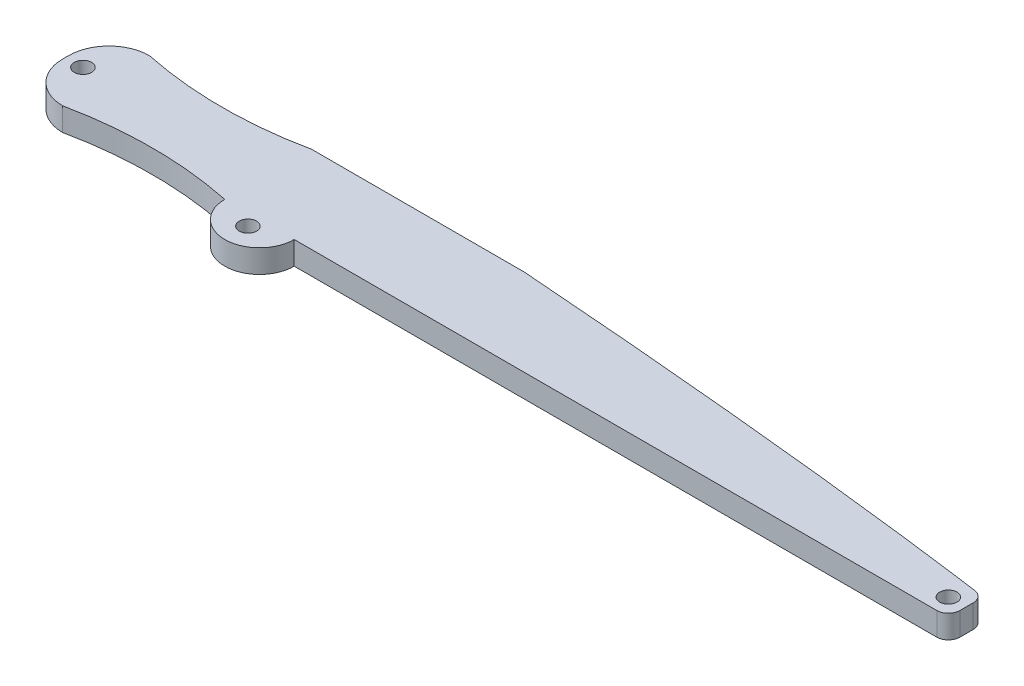
ISO-10303-21;
HEADER;
FILE_DESCRIPTION(('STEP AP214'),'2;1');
FILE_NAME('part.step','',(''),(''),'','','');
FILE_SCHEMA(('AUTOMOTIVE_DESIGN { 1 0 10303 214 1 1 1 1 }'));
ENDSEC;
DATA;
#1=APPLICATION_CONTEXT('core data for automotive mechanical design processes');
#2=APPLICATION_PROTOCOL_DEFINITION('international standard','automotive_design',2000,#1);
#3=PRODUCT_CONTEXT('',#1,'mechanical');
#4=PRODUCT('Part','Part','',(#3));
#5=PRODUCT_RELATED_PRODUCT_CATEGORY('part','',(#4));
#6=PRODUCT_DEFINITION_FORMATION('','',#4);
#7=PRODUCT_DEFINITION_CONTEXT('part definition',#1,'design');
#8=PRODUCT_DEFINITION('design','',#6,#7);
#9=PRODUCT_DEFINITION_SHAPE('','',#8);
#10=(LENGTH_UNIT() NAMED_UNIT(*) SI_UNIT(.MILLI.,.METRE.));
#11=(NAMED_UNIT(*) PLANE_ANGLE_UNIT() SI_UNIT($,.RADIAN.));
#12=(NAMED_UNIT(*) SI_UNIT($,.STERADIAN.) SOLID_ANGLE_UNIT());
#13=UNCERTAINTY_MEASURE_WITH_UNIT(LENGTH_MEASURE(1.E-05),#10,'distance_accuracy_value','');
#14=(GEOMETRIC_REPRESENTATION_CONTEXT(3) GLOBAL_UNCERTAINTY_ASSIGNED_CONTEXT((#13)) GLOBAL_UNIT_ASSIGNED_CONTEXT((#10,
#11,#12)) REPRESENTATION_CONTEXT('',''));
#15=CARTESIAN_POINT('',(0.,0.,0.));
#16=DIRECTION('',(0.,0.,1.));
#17=DIRECTION('',(1.,0.,0.));
#18=AXIS2_PLACEMENT_3D('',#15,#16,#17);
#19=CARTESIAN_POINT('',(-80.,4.,7.5));
#20=DIRECTION('',(0.,0.,-1.));
#21=DIRECTION('',(-1.,0.,0.));
#22=AXIS2_PLACEMENT_3D('',#19,#20,#21);
#23=PLANE('',#22);
#24=DIRECTION('',(1.,0.,0.));
#25=VECTOR('',#24,1.);
#26=CARTESIAN_POINT('',(-80.,0.,7.5));
#27=LINE('',#26,#25);
#28=CARTESIAN_POINT('',(-33.,0.,7.5));
#29=VERTEX_POINT('',#28);
#30=CARTESIAN_POINT('',(78.,0.,7.5));
#31=VERTEX_POINT('',#30);
#32=EDGE_CURVE('E196',#29,#31,#27,.T.);
#33=ORIENTED_EDGE('',*,*,#32,.T.);
#34=DIRECTION('',(0.,-1.,0.));
#35=VECTOR('',#34,1.);
#36=CARTESIAN_POINT('',(78.,4.,7.5));
#37=LINE('',#36,#35);
#38=CARTESIAN_POINT('',(78.,4.,7.5));
#39=VERTEX_POINT('',#38);
#40=EDGE_CURVE('E11',#31,#39,#37,.F.);
#41=ORIENTED_EDGE('',*,*,#40,.T.);
#42=DIRECTION('',(1.,0.,0.));
#43=VECTOR('',#42,1.);
#44=CARTESIAN_POINT('',(-80.,4.,7.5));
#45=LINE('',#44,#43);
#46=CARTESIAN_POINT('',(-33.,4.,7.5));
#47=VERTEX_POINT('',#46);
#48=EDGE_CURVE('E213',#47,#39,#45,.T.);
#49=ORIENTED_EDGE('',*,*,#48,.F.);
#50=DIRECTION('',(0.,-1.,0.));
#51=VECTOR('',#50,1.);
#52=CARTESIAN_POINT('',(-33.,17.4164078649987,7.5));
#53=LINE('',#52,#51);
#54=EDGE_CURVE('E218',#47,#29,#53,.T.);
#55=ORIENTED_EDGE('',*,*,#54,.T.);
#56=EDGE_LOOP('',(#33,#41,#49,#55));
#57=FACE_BOUND('',#56,.T.);
#58=ADVANCED_FACE('F33',(#57),#23,.F.);
#59=CARTESIAN_POINT('',(-80.,4.,-7.5));
#60=DIRECTION('',(1.,0.,0.));
#61=DIRECTION('',(0.,0.,-1.));
#62=AXIS2_PLACEMENT_3D('',#59,#60,#61);
#63=PLANE('',#62);
#64=DIRECTION('',(0.,0.,1.));
#65=VECTOR('',#64,1.);
#66=CARTESIAN_POINT('',(-80.,4.,-7.5));
#67=LINE('',#66,#65);
#68=CARTESIAN_POINT('',(-80.,4.,-0.5));
#69=VERTEX_POINT('',#68);
#70=CARTESIAN_POINT('',(-80.,4.,0.5));
#71=VERTEX_POINT('',#70);
#72=EDGE_CURVE('E199',#69,#71,#67,.T.);
#73=ORIENTED_EDGE('',*,*,#72,.F.);
#74=DIRECTION('',(0.,-1.,0.));
#75=VECTOR('',#74,1.);
#76=CARTESIAN_POINT('',(-80.,4.,-0.5));
#77=LINE('',#76,#75);
#78=CARTESIAN_POINT('',(-80.,0.,-0.5));
#79=VERTEX_POINT('',#78);
#80=EDGE_CURVE('E153',#69,#79,#77,.T.);
#81=ORIENTED_EDGE('',*,*,#80,.T.);
#82=DIRECTION('',(0.,0.,1.));
#83=VECTOR('',#82,1.);
#84=CARTESIAN_POINT('',(-80.,0.,-7.5));
#85=LINE('',#84,#83);
#86=CARTESIAN_POINT('',(-80.,0.,0.5));
#87=VERTEX_POINT('',#86);
#88=EDGE_CURVE('E201',#79,#87,#85,.T.);
#89=ORIENTED_EDGE('',*,*,#88,.T.);
#90=DIRECTION('',(0.,-1.,0.));
#91=VECTOR('',#90,1.);
#92=CARTESIAN_POINT('',(-80.,4.,0.5));
#93=LINE('',#92,#91);
#94=EDGE_CURVE('E151',#87,#71,#93,.F.);
#95=ORIENTED_EDGE('',*,*,#94,.T.);
#96=EDGE_LOOP('',(#73,#81,#89,#95));
#97=FACE_BOUND('',#96,.T.);
#98=ADVANCED_FACE('F294',(#97),#63,.F.);
#99=CARTESIAN_POINT('',(80.,4.,-7.5));
#100=DIRECTION('',(-1.,0.,0.));
#101=DIRECTION('',(0.,0.,1.));
#102=AXIS2_PLACEMENT_3D('',#99,#100,#101);
#103=PLANE('',#102);
#104=DIRECTION('',(0.,0.,-1.));
#105=VECTOR('',#104,1.);
#106=CARTESIAN_POINT('',(80.,4.,-7.5));
#107=LINE('',#106,#105);
#108=CARTESIAN_POINT('',(80.,4.,5.5));
#109=VERTEX_POINT('',#108);
#110=CARTESIAN_POINT('',(80.,4.,3.20141705599175));
#111=VERTEX_POINT('',#110);
#112=EDGE_CURVE('E192',#109,#111,#107,.T.);
#113=ORIENTED_EDGE('',*,*,#112,.F.);
#114=DIRECTION('',(0.,-1.,0.));
#115=VECTOR('',#114,1.);
#116=CARTESIAN_POINT('',(80.,4.,5.5));
#117=LINE('',#116,#115);
#118=CARTESIAN_POINT('',(80.,0.,5.5));
#119=VERTEX_POINT('',#118);
#120=EDGE_CURVE('E41',#109,#119,#117,.T.);
#121=ORIENTED_EDGE('',*,*,#120,.T.);
#122=DIRECTION('',(0.,0.,-1.));
#123=VECTOR('',#122,1.);
#124=CARTESIAN_POINT('',(80.,0.,-7.5));
#125=LINE('',#124,#123);
#126=CARTESIAN_POINT('',(80.,0.,3.20141705599175));
#127=VERTEX_POINT('',#126);
#128=EDGE_CURVE('E189',#119,#127,#125,.T.);
#129=ORIENTED_EDGE('',*,*,#128,.T.);
#130=DIRECTION('',(0.,1.,0.));
#131=VECTOR('',#130,1.);
#132=CARTESIAN_POINT('',(80.,4.,3.20141705599175));
#133=LINE('',#132,#131);
#134=EDGE_CURVE('E182',#127,#111,#133,.T.);
#135=ORIENTED_EDGE('',*,*,#134,.T.);
#136=EDGE_LOOP('',(#113,#121,#129,#135));
#137=FACE_BOUND('',#136,.T.);
#138=ADVANCED_FACE('F188',(#137),#103,.F.);
#139=CARTESIAN_POINT('',(-80.,4.,-7.5));
#140=DIRECTION('',(0.,0.,1.));
#141=DIRECTION('',(1.,0.,0.));
#142=AXIS2_PLACEMENT_3D('',#139,#140,#141);
#143=PLANE('',#142);
#144=DIRECTION('',(-1.,0.,0.));
#145=VECTOR('',#144,1.);
#146=CARTESIAN_POINT('',(-80.,0.,-7.5));
#147=LINE('',#146,#145);
#148=CARTESIAN_POINT('',(-8.30383734697389,0.,-7.5));
#149=VERTEX_POINT('',#148);
#150=CARTESIAN_POINT('',(-45.,0.,-7.5));
#151=VERTEX_POINT('',#150);
#152=EDGE_CURVE('E195',#149,#151,#147,.T.);
#153=ORIENTED_EDGE('',*,*,#152,.T.);
#154=DIRECTION('',(0.,1.,0.));
#155=VECTOR('',#154,1.);
#156=CARTESIAN_POINT('',(-45.,0.,-7.5));
#157=LINE('',#156,#155);
#158=CARTESIAN_POINT('',(-45.,4.,-7.5));
#159=VERTEX_POINT('',#158);
#160=EDGE_CURVE('E238',#151,#159,#157,.T.);
#161=ORIENTED_EDGE('',*,*,#160,.T.);
#162=DIRECTION('',(-1.,0.,0.));
#163=VECTOR('',#162,1.);
#164=CARTESIAN_POINT('',(-80.,4.,-7.5));
#165=LINE('',#164,#163);
#166=CARTESIAN_POINT('',(-8.30383734697389,4.,-7.5));
#167=VERTEX_POINT('',#166);
#168=EDGE_CURVE('E204',#167,#159,#165,.T.);
#169=ORIENTED_EDGE('',*,*,#168,.F.);
#170=DIRECTION('',(0.,1.,0.));
#171=VECTOR('',#170,1.);
#172=CARTESIAN_POINT('',(-8.30383734697389,4.,-7.5));
#173=LINE('',#172,#171);
#174=EDGE_CURVE('E176',#167,#149,#173,.F.);
#175=ORIENTED_EDGE('',*,*,#174,.T.);
#176=EDGE_LOOP('',(#153,#161,#169,#175));
#177=FACE_BOUND('',#176,.T.);
#178=ADVANCED_FACE('F285',(#177),#143,.F.);
#179=CARTESIAN_POINT('',(0.,4.,0.));
#180=DIRECTION('',(0.,1.,0.));
#181=DIRECTION('',(0.,0.,1.));
#182=AXIS2_PLACEMENT_3D('',#179,#180,#181);
#183=PLANE('',#182);
#184=CARTESIAN_POINT('',(-59.,4.,74.1454049428766));
#185=DIRECTION('',(0.,1.,0.));
#186=DIRECTION('',(0.,0.,1.));
#187=AXIS2_PLACEMENT_3D('',#184,#185,#186);
#188=CIRCLE('',#187,68.1);
#189=CARTESIAN_POINT('',(-45.,4.,7.5));
#190=VERTEX_POINT('',#189);
#191=CARTESIAN_POINT('',(-73.,4.,7.5));
#192=VERTEX_POINT('',#191);
#193=EDGE_CURVE('E132',#190,#192,#188,.T.);
#194=ORIENTED_EDGE('',*,*,#193,.F.);
#195=CARTESIAN_POINT('',(-39.,4.,7.5));
#196=DIRECTION('',(0.,1.,0.));
#197=DIRECTION('',(0.,0.,1.));
#198=AXIS2_PLACEMENT_3D('',#195,#196,#197);
#199=CIRCLE('',#198,6.);
#200=EDGE_CURVE('E216',#190,#47,#199,.T.);
#201=ORIENTED_EDGE('',*,*,#200,.T.);
#202=ORIENTED_EDGE('',*,*,#48,.T.);
#203=CARTESIAN_POINT('',(78.,4.,5.5));
#204=DIRECTION('',(0.,1.,0.));
#205=DIRECTION('',(0.,0.,1.));
#206=AXIS2_PLACEMENT_3D('',#203,#204,#205);
#207=CIRCLE('',#206,2.);
#208=EDGE_CURVE('E172',#39,#109,#207,.T.);
#209=ORIENTED_EDGE('',*,*,#208,.T.);
#210=ORIENTED_EDGE('',*,*,#112,.T.);
#211=CARTESIAN_POINT('',(78.,4.,3.20141705599175));
#212=DIRECTION('',(0.,1.,0.));
#213=DIRECTION('',(0.,0.,1.));
#214=AXIS2_PLACEMENT_3D('',#211,#212,#213);
#215=CIRCLE('',#214,2.);
#216=CARTESIAN_POINT('',(78.2649026813896,4.,1.21903803839885));
#217=VERTEX_POINT('',#216);
#218=EDGE_CURVE('E170',#111,#217,#215,.T.);
#219=ORIENTED_EDGE('',*,*,#218,.T.);
#220=CARTESIAN_POINT('',(-8.23154683285153,4.,-7.5));
#221=CARTESIAN_POINT('',(14.2900819028801,4.,-5.87033542457917));
#222=CARTESIAN_POINT('',(49.538058277819,4.,-2.84864090917084));
#223=CARTESIAN_POINT('',(69.5080011227634,4.,0.0694157231703041));
#224=CARTESIAN_POINT('',(80.,4.,1.44942523242543));
#225=B_SPLINE_CURVE_WITH_KNOTS('',4,(#220,#221,#222,#223,#224),.UNSPECIFIED.,.F.,.F.,(5,5),(0.,
1.),.UNSPECIFIED.);
#226=CARTESIAN_POINT('',(-8.15939514959935,4.,-7.49477729373923));
#227=VERTEX_POINT('',#226);
#228=EDGE_CURVE('E147',#227,#217,#225,.T.);
#229=ORIENTED_EDGE('',*,*,#228,.F.);
#230=CARTESIAN_POINT('',(-8.30383734697389,4.,-5.5));
#231=DIRECTION('',(0.,1.,0.));
#232=DIRECTION('',(0.,0.,1.));
#233=AXIS2_PLACEMENT_3D('',#230,#231,#232);
#234=CIRCLE('',#233,2.);
#235=EDGE_CURVE('E174',#227,#167,#234,.T.);
#236=ORIENTED_EDGE('',*,*,#235,.T.);
#237=ORIENTED_EDGE('',*,*,#168,.T.);
#238=CARTESIAN_POINT('',(-59.,4.,-74.1454049428766));
#239=DIRECTION('',(0.,1.,0.));
#240=DIRECTION('',(0.,0.,1.));
#241=AXIS2_PLACEMENT_3D('',#238,#239,#240);
#242=CIRCLE('',#241,68.1);
#243=CARTESIAN_POINT('',(-73.,4.,-7.5));
#244=VERTEX_POINT('',#243);
#245=EDGE_CURVE('E246',#244,#159,#242,.T.);
#246=ORIENTED_EDGE('',*,*,#245,.F.);
#247=CARTESIAN_POINT('',(-73.,4.,-0.5));
#248=DIRECTION('',(0.,1.,0.));
#249=DIRECTION('',(0.,0.,1.));
#250=AXIS2_PLACEMENT_3D('',#247,#248,#249);
#251=CIRCLE('',#250,7.);
#252=EDGE_CURVE('E138',#244,#69,#251,.T.);
#253=ORIENTED_EDGE('',*,*,#252,.T.);
#254=ORIENTED_EDGE('',*,*,#72,.T.);
#255=CARTESIAN_POINT('',(-73.,4.,0.5));
#256=DIRECTION('',(0.,1.,0.));
#257=DIRECTION('',(0.,0.,1.));
#258=AXIS2_PLACEMENT_3D('',#255,#256,#257);
#259=CIRCLE('',#258,7.);
#260=EDGE_CURVE('E163',#71,#192,#259,.T.);
#261=ORIENTED_EDGE('',*,*,#260,.T.);
#262=EDGE_LOOP('',(#194,#201,#202,#209,#210,#219,#229,#236,#237,#246,#253,#254,#261));
#263=FACE_BOUND('',#262,.T.);
#264=CARTESIAN_POINT('',(-77.,4.,0.));
#265=DIRECTION('',(0.,1.,0.));
#266=DIRECTION('',(0.,0.,1.));
#267=AXIS2_PLACEMENT_3D('',#264,#265,#266);
#268=CIRCLE('',#267,1.5);
#269=CARTESIAN_POINT('',(-77.,4.,1.5));
#270=VERTEX_POINT('',#269);
#271=EDGE_CURVE('E455',#270,#270,#268,.T.);
#272=ORIENTED_EDGE('',*,*,#271,.F.);
#273=EDGE_LOOP('',(#272));
#274=FACE_BOUND('',#273,.T.);
#275=CARTESIAN_POINT('',(-39.,4.,9.5));
#276=DIRECTION('',(0.,1.,0.));
#277=DIRECTION('',(0.,0.,1.));
#278=AXIS2_PLACEMENT_3D('',#275,#276,#277);
#279=CIRCLE('',#278,1.5);
#280=CARTESIAN_POINT('',(-39.,4.,11.));
#281=VERTEX_POINT('',#280);
#282=EDGE_CURVE('E448',#281,#281,#279,.T.);
#283=ORIENTED_EDGE('',*,*,#282,.F.);
#284=EDGE_LOOP('',(#283));
#285=FACE_BOUND('',#284,.T.);
#286=CARTESIAN_POINT('',(77.,4.,4.5));
#287=DIRECTION('',(0.,1.,0.));
#288=DIRECTION('',(0.,0.,1.));
#289=AXIS2_PLACEMENT_3D('',#286,#287,#288);
#290=CIRCLE('',#289,1.5);
#291=CARTESIAN_POINT('',(77.,4.,6.));
#292=VERTEX_POINT('',#291);
#293=EDGE_CURVE('E253',#292,#292,#290,.T.);
#294=ORIENTED_EDGE('',*,*,#293,.F.);
#295=EDGE_LOOP('',(#294));
#296=FACE_BOUND('',#295,.T.);
#297=ADVANCED_FACE('F230',(#263,#274,#285,#296),#183,.T.);
#298=CARTESIAN_POINT('',(0.,0.,0.));
#299=DIRECTION('',(0.,1.,0.));
#300=DIRECTION('',(0.,0.,1.));
#301=AXIS2_PLACEMENT_3D('',#298,#299,#300);
#302=PLANE('',#301);
#303=CARTESIAN_POINT('',(-77.,0.,0.));
#304=DIRECTION('',(0.,1.,0.));
#305=DIRECTION('',(0.,0.,1.));
#306=AXIS2_PLACEMENT_3D('',#303,#304,#305);
#307=CIRCLE('',#306,1.5);
#308=CARTESIAN_POINT('',(-77.,0.,1.5));
#309=VERTEX_POINT('',#308);
#310=EDGE_CURVE('E229',#309,#309,#307,.T.);
#311=ORIENTED_EDGE('',*,*,#310,.T.);
#312=EDGE_LOOP('',(#311));
#313=FACE_BOUND('',#312,.T.);
#314=CARTESIAN_POINT('',(-39.,0.,9.5));
#315=DIRECTION('',(0.,1.,0.));
#316=DIRECTION('',(0.,0.,1.));
#317=AXIS2_PLACEMENT_3D('',#314,#315,#316);
#318=CIRCLE('',#317,1.5);
#319=CARTESIAN_POINT('',(-39.,0.,11.));
#320=VERTEX_POINT('',#319);
#321=EDGE_CURVE('E444',#320,#320,#318,.T.);
#322=ORIENTED_EDGE('',*,*,#321,.T.);
#323=EDGE_LOOP('',(#322));
#324=FACE_BOUND('',#323,.T.);
#325=CARTESIAN_POINT('',(77.,0.,4.5));
#326=DIRECTION('',(0.,1.,0.));
#327=DIRECTION('',(0.,0.,1.));
#328=AXIS2_PLACEMENT_3D('',#325,#326,#327);
#329=CIRCLE('',#328,1.5);
#330=CARTESIAN_POINT('',(77.,0.,6.));
#331=VERTEX_POINT('',#330);
#332=EDGE_CURVE('E447',#331,#331,#329,.T.);
#333=ORIENTED_EDGE('',*,*,#332,.T.);
#334=EDGE_LOOP('',(#333));
#335=FACE_BOUND('',#334,.T.);
#336=CARTESIAN_POINT('',(-39.,0.,7.5));
#337=DIRECTION('',(0.,1.,0.));
#338=DIRECTION('',(0.,0.,1.));
#339=AXIS2_PLACEMENT_3D('',#336,#337,#338);
#340=CIRCLE('',#339,6.);
#341=CARTESIAN_POINT('',(-45.,0.,7.5));
#342=VERTEX_POINT('',#341);
#343=EDGE_CURVE('E146',#342,#29,#340,.T.);
#344=ORIENTED_EDGE('',*,*,#343,.F.);
#345=CARTESIAN_POINT('',(-59.,0.,74.1454049428766));
#346=DIRECTION('',(0.,1.,0.));
#347=DIRECTION('',(0.,0.,1.));
#348=AXIS2_PLACEMENT_3D('',#345,#346,#347);
#349=CIRCLE('',#348,68.1);
#350=CARTESIAN_POINT('',(-73.,0.,7.5));
#351=VERTEX_POINT('',#350);
#352=EDGE_CURVE('E129',#342,#351,#349,.T.);
#353=ORIENTED_EDGE('',*,*,#352,.T.);
#354=CARTESIAN_POINT('',(-73.,0.,0.5));
#355=DIRECTION('',(0.,1.,0.));
#356=DIRECTION('',(0.,0.,1.));
#357=AXIS2_PLACEMENT_3D('',#354,#355,#356);
#358=CIRCLE('',#357,7.);
#359=EDGE_CURVE('E143',#351,#87,#358,.F.);
#360=ORIENTED_EDGE('',*,*,#359,.T.);
#361=ORIENTED_EDGE('',*,*,#88,.F.);
#362=CARTESIAN_POINT('',(-73.,0.,-0.5));
#363=DIRECTION('',(0.,1.,0.));
#364=DIRECTION('',(0.,0.,1.));
#365=AXIS2_PLACEMENT_3D('',#362,#363,#364);
#366=CIRCLE('',#365,7.);
#367=CARTESIAN_POINT('',(-73.,0.,-7.5));
#368=VERTEX_POINT('',#367);
#369=EDGE_CURVE('E152',#79,#368,#366,.F.);
#370=ORIENTED_EDGE('',*,*,#369,.T.);
#371=CARTESIAN_POINT('',(-59.,0.,-74.1454049428766));
#372=DIRECTION('',(0.,1.,0.));
#373=DIRECTION('',(0.,0.,1.));
#374=AXIS2_PLACEMENT_3D('',#371,#372,#373);
#375=CIRCLE('',#374,68.1);
#376=EDGE_CURVE('E241',#368,#151,#375,.T.);
#377=ORIENTED_EDGE('',*,*,#376,.T.);
#378=ORIENTED_EDGE('',*,*,#152,.F.);
#379=CARTESIAN_POINT('',(-8.30383734697389,0.,-5.5));
#380=DIRECTION('',(0.,1.,0.));
#381=DIRECTION('',(0.,0.,1.));
#382=AXIS2_PLACEMENT_3D('',#379,#380,#381);
#383=CIRCLE('',#382,2.);
#384=CARTESIAN_POINT('',(-8.15939514959935,0.,-7.49477729373923));
#385=VERTEX_POINT('',#384);
#386=EDGE_CURVE('E180',#149,#385,#383,.F.);
#387=ORIENTED_EDGE('',*,*,#386,.T.);
#388=CARTESIAN_POINT('',(-8.23154683285153,0.,-7.5));
#389=CARTESIAN_POINT('',(14.2900819028801,0.,-5.87033542457917));
#390=CARTESIAN_POINT('',(49.538058277819,0.,-2.84864090917084));
#391=CARTESIAN_POINT('',(69.5080011227634,0.,0.0694157231703041));
#392=CARTESIAN_POINT('',(80.,0.,1.44942523242543));
#393=B_SPLINE_CURVE_WITH_KNOTS('',4,(#388,#389,#390,#391,#392),.UNSPECIFIED.,.F.,.F.,(5,5),(0.,
1.),.UNSPECIFIED.);
#394=CARTESIAN_POINT('',(78.2649026813896,0.,1.21903803839885));
#395=VERTEX_POINT('',#394);
#396=EDGE_CURVE('E248',#385,#395,#393,.T.);
#397=ORIENTED_EDGE('',*,*,#396,.T.);
#398=CARTESIAN_POINT('',(78.,0.,3.20141705599175));
#399=DIRECTION('',(0.,1.,0.));
#400=DIRECTION('',(0.,0.,1.));
#401=AXIS2_PLACEMENT_3D('',#398,#399,#400);
#402=CIRCLE('',#401,2.);
#403=EDGE_CURVE('E54',#395,#127,#402,.F.);
#404=ORIENTED_EDGE('',*,*,#403,.T.);
#405=ORIENTED_EDGE('',*,*,#128,.F.);
#406=CARTESIAN_POINT('',(78.,0.,5.5));
#407=DIRECTION('',(0.,1.,0.));
#408=DIRECTION('',(0.,0.,1.));
#409=AXIS2_PLACEMENT_3D('',#406,#407,#408);
#410=CIRCLE('',#409,2.);
#411=EDGE_CURVE('E48',#119,#31,#410,.F.);
#412=ORIENTED_EDGE('',*,*,#411,.T.);
#413=ORIENTED_EDGE('',*,*,#32,.F.);
#414=EDGE_LOOP('',(#344,#353,#360,#361,#370,#377,#378,#387,#397,#404,#405,#412,#413));
#415=FACE_BOUND('',#414,.T.);
#416=ADVANCED_FACE('F141',(#313,#324,#335,#415),#302,.F.);
#417=CARTESIAN_POINT('',(-39.,17.4164078649987,7.5));
#418=DIRECTION('',(0.,-1.,0.));
#419=DIRECTION('',(0.,0.,-1.));
#420=AXIS2_PLACEMENT_3D('',#417,#418,#419);
#421=CYLINDRICAL_SURFACE('',#420,6.);
#422=ORIENTED_EDGE('',*,*,#200,.F.);
#423=DIRECTION('',(0.,-1.,0.));
#424=VECTOR('',#423,1.);
#425=CARTESIAN_POINT('',(-45.,17.4164078649987,7.5));
#426=LINE('',#425,#424);
#427=EDGE_CURVE('E227',#190,#342,#426,.T.);
#428=ORIENTED_EDGE('',*,*,#427,.T.);
#429=ORIENTED_EDGE('',*,*,#343,.T.);
#430=ORIENTED_EDGE('',*,*,#54,.F.);
#431=EDGE_LOOP('',(#422,#428,#429,#430));
#432=FACE_BOUND('',#431,.T.);
#433=ADVANCED_FACE('F237',(#432),#421,.T.);
#434=CARTESIAN_POINT('',(77.,0.,4.5));
#435=DIRECTION('',(0.,1.,0.));
#436=DIRECTION('',(0.,0.,1.));
#437=AXIS2_PLACEMENT_3D('',#434,#435,#436);
#438=CYLINDRICAL_SURFACE('',#437,1.5);
#439=ORIENTED_EDGE('',*,*,#332,.F.);
#440=EDGE_LOOP('',(#439));
#441=FACE_BOUND('',#440,.T.);
#442=ORIENTED_EDGE('',*,*,#293,.T.);
#443=EDGE_LOOP('',(#442));
#444=FACE_BOUND('',#443,.T.);
#445=ADVANCED_FACE('F276',(#441,#444),#438,.F.);
#446=CARTESIAN_POINT('',(-39.,0.,9.5));
#447=DIRECTION('',(0.,1.,0.));
#448=DIRECTION('',(0.,0.,1.));
#449=AXIS2_PLACEMENT_3D('',#446,#447,#448);
#450=CYLINDRICAL_SURFACE('',#449,1.5);
#451=ORIENTED_EDGE('',*,*,#321,.F.);
#452=EDGE_LOOP('',(#451));
#453=FACE_BOUND('',#452,.T.);
#454=ORIENTED_EDGE('',*,*,#282,.T.);
#455=EDGE_LOOP('',(#454));
#456=FACE_BOUND('',#455,.T.);
#457=ADVANCED_FACE('F272',(#453,#456),#450,.F.);
#458=CARTESIAN_POINT('',(-77.,0.,0.));
#459=DIRECTION('',(0.,1.,0.));
#460=DIRECTION('',(0.,0.,1.));
#461=AXIS2_PLACEMENT_3D('',#458,#459,#460);
#462=CYLINDRICAL_SURFACE('',#461,1.5);
#463=ORIENTED_EDGE('',*,*,#310,.F.);
#464=EDGE_LOOP('',(#463));
#465=FACE_BOUND('',#464,.T.);
#466=ORIENTED_EDGE('',*,*,#271,.T.);
#467=EDGE_LOOP('',(#466));
#468=FACE_BOUND('',#467,.T.);
#469=ADVANCED_FACE('F266',(#465,#468),#462,.F.);
#470=DIRECTION('',(0.,1.,0.));
#471=VECTOR('',#470,1.);
#472=SURFACE_OF_LINEAR_EXTRUSION('',#393,#471);
#473=ORIENTED_EDGE('',*,*,#396,.F.);
#474=DIRECTION('',(0.,1.,0.));
#475=VECTOR('',#474,1.);
#476=CARTESIAN_POINT('',(-8.15939514959935,0.,-7.49477729373923));
#477=LINE('',#476,#475);
#478=EDGE_CURVE('E167',#385,#227,#477,.T.);
#479=ORIENTED_EDGE('',*,*,#478,.T.);
#480=ORIENTED_EDGE('',*,*,#228,.T.);
#481=DIRECTION('',(0.,1.,0.));
#482=VECTOR('',#481,1.);
#483=CARTESIAN_POINT('',(78.2649026813938,4.,1.2190380383994));
#484=LINE('',#483,#482);
#485=EDGE_CURVE('E137',#217,#395,#484,.F.);
#486=ORIENTED_EDGE('',*,*,#485,.T.);
#487=EDGE_LOOP('',(#473,#479,#480,#486));
#488=FACE_BOUND('',#487,.T.);
#489=ADVANCED_FACE('F261',(#488),#472,.F.);
#490=CARTESIAN_POINT('',(-73.,4.,-0.5));
#491=DIRECTION('',(0.,-1.,0.));
#492=DIRECTION('',(0.,0.,-1.));
#493=AXIS2_PLACEMENT_3D('',#490,#491,#492);
#494=CYLINDRICAL_SURFACE('',#493,7.);
#495=ORIENTED_EDGE('',*,*,#252,.F.);
#496=DIRECTION('',(0.,-1.,0.));
#497=VECTOR('',#496,1.);
#498=CARTESIAN_POINT('',(-73.,4.,-7.5));
#499=LINE('',#498,#497);
#500=EDGE_CURVE('E156',#368,#244,#499,.F.);
#501=ORIENTED_EDGE('',*,*,#500,.F.);
#502=ORIENTED_EDGE('',*,*,#369,.F.);
#503=ORIENTED_EDGE('',*,*,#80,.F.);
#504=EDGE_LOOP('',(#495,#501,#502,#503));
#505=FACE_BOUND('',#504,.T.);
#506=ADVANCED_FACE('F265',(#505),#494,.T.);
#507=CARTESIAN_POINT('',(-73.,4.,0.5));
#508=DIRECTION('',(0.,-1.,0.));
#509=DIRECTION('',(0.,0.,-1.));
#510=AXIS2_PLACEMENT_3D('',#507,#508,#509);
#511=CYLINDRICAL_SURFACE('',#510,7.);
#512=ORIENTED_EDGE('',*,*,#260,.F.);
#513=ORIENTED_EDGE('',*,*,#94,.F.);
#514=ORIENTED_EDGE('',*,*,#359,.F.);
#515=DIRECTION('',(0.,-1.,0.));
#516=VECTOR('',#515,1.);
#517=CARTESIAN_POINT('',(-73.,4.,7.5));
#518=LINE('',#517,#516);
#519=EDGE_CURVE('E126',#192,#351,#518,.T.);
#520=ORIENTED_EDGE('',*,*,#519,.F.);
#521=EDGE_LOOP('',(#512,#513,#514,#520));
#522=FACE_BOUND('',#521,.T.);
#523=ADVANCED_FACE('F150',(#522),#511,.T.);
#524=CARTESIAN_POINT('',(-8.30383734697389,2.,-5.5));
#525=DIRECTION('',(0.,1.,0.));
#526=DIRECTION('',(0.,0.,1.));
#527=AXIS2_PLACEMENT_3D('',#524,#525,#526);
#528=CYLINDRICAL_SURFACE('',#527,2.);
#529=ORIENTED_EDGE('',*,*,#386,.F.);
#530=ORIENTED_EDGE('',*,*,#174,.F.);
#531=ORIENTED_EDGE('',*,*,#235,.F.);
#532=ORIENTED_EDGE('',*,*,#478,.F.);
#533=EDGE_LOOP('',(#529,#530,#531,#532));
#534=FACE_BOUND('',#533,.T.);
#535=ADVANCED_FACE('F304',(#534),#528,.T.);
#536=CARTESIAN_POINT('',(78.,4.,5.5));
#537=DIRECTION('',(0.,-1.,0.));
#538=DIRECTION('',(0.,0.,-1.));
#539=AXIS2_PLACEMENT_3D('',#536,#537,#538);
#540=CYLINDRICAL_SURFACE('',#539,2.);
#541=ORIENTED_EDGE('',*,*,#208,.F.);
#542=ORIENTED_EDGE('',*,*,#40,.F.);
#543=ORIENTED_EDGE('',*,*,#411,.F.);
#544=ORIENTED_EDGE('',*,*,#120,.F.);
#545=EDGE_LOOP('',(#541,#542,#543,#544));
#546=FACE_BOUND('',#545,.T.);
#547=ADVANCED_FACE('F235',(#546),#540,.T.);
#548=CARTESIAN_POINT('',(78.,2.,3.20141705599175));
#549=DIRECTION('',(0.,1.,0.));
#550=DIRECTION('',(0.,0.,1.));
#551=AXIS2_PLACEMENT_3D('',#548,#549,#550);
#552=CYLINDRICAL_SURFACE('',#551,2.);
#553=ORIENTED_EDGE('',*,*,#403,.F.);
#554=ORIENTED_EDGE('',*,*,#485,.F.);
#555=ORIENTED_EDGE('',*,*,#218,.F.);
#556=ORIENTED_EDGE('',*,*,#134,.F.);
#557=EDGE_LOOP('',(#553,#554,#555,#556));
#558=FACE_BOUND('',#557,.T.);
#559=ADVANCED_FACE('F35',(#558),#552,.T.);
#560=CARTESIAN_POINT('',(-59.,0.,74.1454049428766));
#561=DIRECTION('',(0.,1.,0.));
#562=DIRECTION('',(0.,0.,1.));
#563=AXIS2_PLACEMENT_3D('',#560,#561,#562);
#564=CYLINDRICAL_SURFACE('',#563,68.1);
#565=ORIENTED_EDGE('',*,*,#193,.T.);
#566=ORIENTED_EDGE('',*,*,#519,.T.);
#567=ORIENTED_EDGE('',*,*,#352,.F.);
#568=ORIENTED_EDGE('',*,*,#427,.F.);
#569=EDGE_LOOP('',(#565,#566,#567,#568));
#570=FACE_BOUND('',#569,.T.);
#571=ADVANCED_FACE('F128',(#570),#564,.F.);
#572=CARTESIAN_POINT('',(-59.,0.,-74.1454049428766));
#573=DIRECTION('',(0.,1.,0.));
#574=DIRECTION('',(0.,0.,1.));
#575=AXIS2_PLACEMENT_3D('',#572,#573,#574);
#576=CYLINDRICAL_SURFACE('',#575,68.1);
#577=ORIENTED_EDGE('',*,*,#245,.T.);
#578=ORIENTED_EDGE('',*,*,#160,.F.);
#579=ORIENTED_EDGE('',*,*,#376,.F.);
#580=ORIENTED_EDGE('',*,*,#500,.T.);
#581=EDGE_LOOP('',(#577,#578,#579,#580));
#582=FACE_BOUND('',#581,.T.);
#583=ADVANCED_FACE('F268',(#582),#576,.F.);
#584=CLOSED_SHELL('',(#58,#98,#138,#178,#297,#416,#433,#445,#457,#469,#489,#506,#523,#535,#547,
#559,#571,#583));
#585=MANIFOLD_SOLID_BREP('B2',#584);
#586=ADVANCED_BREP_SHAPE_REPRESENTATION('',(#18,#585),#14);
#587=SHAPE_DEFINITION_REPRESENTATION(#9,#586);
ENDSEC;
END-ISO-10303-21;
